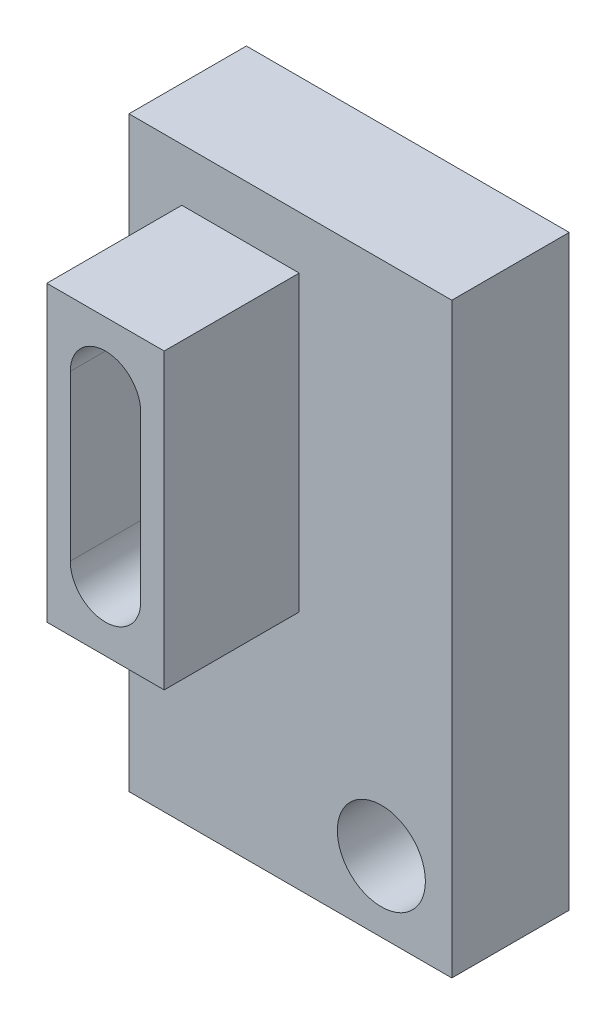
ISO-10303-21;
HEADER;
FILE_DESCRIPTION(('STEP AP214'),'2;1');
FILE_NAME('part.step','',(''),(''),'','','');
FILE_SCHEMA(('AUTOMOTIVE_DESIGN { 1 0 10303 214 1 1 1 1 }'));
ENDSEC;
DATA;
#1=APPLICATION_CONTEXT('core data for automotive mechanical design processes');
#2=APPLICATION_PROTOCOL_DEFINITION('international standard','automotive_design',2000,#1);
#3=PRODUCT_CONTEXT('',#1,'mechanical');
#4=PRODUCT('Part','Part','',(#3));
#5=PRODUCT_RELATED_PRODUCT_CATEGORY('part','',(#4));
#6=PRODUCT_DEFINITION_FORMATION('','',#4);
#7=PRODUCT_DEFINITION_CONTEXT('part definition',#1,'design');
#8=PRODUCT_DEFINITION('design','',#6,#7);
#9=PRODUCT_DEFINITION_SHAPE('','',#8);
#10=(LENGTH_UNIT() NAMED_UNIT(*) SI_UNIT(.MILLI.,.METRE.));
#11=(NAMED_UNIT(*) PLANE_ANGLE_UNIT() SI_UNIT($,.RADIAN.));
#12=(NAMED_UNIT(*) SI_UNIT($,.STERADIAN.) SOLID_ANGLE_UNIT());
#13=UNCERTAINTY_MEASURE_WITH_UNIT(LENGTH_MEASURE(1.E-05),#10,'distance_accuracy_value','');
#14=(GEOMETRIC_REPRESENTATION_CONTEXT(3) GLOBAL_UNCERTAINTY_ASSIGNED_CONTEXT((#13)) GLOBAL_UNIT_ASSIGNED_CONTEXT((#10,
#11,#12)) REPRESENTATION_CONTEXT('',''));
#15=CARTESIAN_POINT('',(0.,0.,0.));
#16=DIRECTION('',(0.,0.,1.));
#17=DIRECTION('',(1.,0.,0.));
#18=AXIS2_PLACEMENT_3D('',#15,#16,#17);
#19=CARTESIAN_POINT('',(0.,0.,20.));
#20=DIRECTION('',(0.,0.,-1.));
#21=DIRECTION('',(-1.,0.,0.));
#22=AXIS2_PLACEMENT_3D('',#19,#20,#21);
#23=PLANE('',#22);
#24=DIRECTION('',(0.,1.,0.));
#25=VECTOR('',#24,1.);
#26=CARTESIAN_POINT('',(27.5,-50.,20.));
#27=LINE('',#26,#25);
#28=CARTESIAN_POINT('',(27.5,-50.,20.));
#29=VERTEX_POINT('',#28);
#30=CARTESIAN_POINT('',(27.5,50.,20.));
#31=VERTEX_POINT('',#30);
#32=EDGE_CURVE('E210',#29,#31,#27,.T.);
#33=ORIENTED_EDGE('',*,*,#32,.T.);
#34=DIRECTION('',(-1.,0.,0.));
#35=VECTOR('',#34,1.);
#36=CARTESIAN_POINT('',(-27.5,50.,20.));
#37=LINE('',#36,#35);
#38=CARTESIAN_POINT('',(-27.5,50.,20.));
#39=VERTEX_POINT('',#38);
#40=EDGE_CURVE('E213',#31,#39,#37,.T.);
#41=ORIENTED_EDGE('',*,*,#40,.T.);
#42=DIRECTION('',(0.,-1.,0.));
#43=VECTOR('',#42,1.);
#44=CARTESIAN_POINT('',(-27.5,-50.,20.));
#45=LINE('',#44,#43);
#46=CARTESIAN_POINT('',(-27.5,-50.,20.));
#47=VERTEX_POINT('',#46);
#48=EDGE_CURVE('E216',#39,#47,#45,.T.);
#49=ORIENTED_EDGE('',*,*,#48,.T.);
#50=DIRECTION('',(1.,0.,0.));
#51=VECTOR('',#50,1.);
#52=CARTESIAN_POINT('',(-27.5,-50.,20.));
#53=LINE('',#52,#51);
#54=EDGE_CURVE('E218',#47,#29,#53,.T.);
#55=ORIENTED_EDGE('',*,*,#54,.T.);
#56=EDGE_LOOP('',(#33,#41,#49,#55));
#57=FACE_BOUND('',#56,.T.);
#58=CARTESIAN_POINT('',(15.5,-38.,20.));
#59=DIRECTION('',(0.,0.,1.));
#60=DIRECTION('',(1.,0.,0.));
#61=AXIS2_PLACEMENT_3D('',#58,#59,#60);
#62=CIRCLE('',#61,7.5);
#63=CARTESIAN_POINT('',(23.,-38.,20.));
#64=VERTEX_POINT('',#63);
#65=EDGE_CURVE('E203',#64,#64,#62,.T.);
#66=ORIENTED_EDGE('',*,*,#65,.F.);
#67=EDGE_LOOP('',(#66));
#68=FACE_BOUND('',#67,.T.);
#69=DIRECTION('',(0.,1.,0.));
#70=VECTOR('',#69,1.);
#71=CARTESIAN_POINT('',(1.5,-9.,20.));
#72=LINE('',#71,#70);
#73=CARTESIAN_POINT('',(1.5,-9.,20.));
#74=VERTEX_POINT('',#73);
#75=CARTESIAN_POINT('',(1.5,41.,20.));
#76=VERTEX_POINT('',#75);
#77=EDGE_CURVE('E167',#74,#76,#72,.T.);
#78=ORIENTED_EDGE('',*,*,#77,.F.);
#79=DIRECTION('',(1.,0.,0.));
#80=VECTOR('',#79,1.);
#81=CARTESIAN_POINT('',(-18.5,-9.,20.));
#82=LINE('',#81,#80);
#83=CARTESIAN_POINT('',(-18.5,-9.,20.));
#84=VERTEX_POINT('',#83);
#85=EDGE_CURVE('E175',#84,#74,#82,.T.);
#86=ORIENTED_EDGE('',*,*,#85,.F.);
#87=DIRECTION('',(0.,-1.,0.));
#88=VECTOR('',#87,1.);
#89=CARTESIAN_POINT('',(-18.5,-9.,20.));
#90=LINE('',#89,#88);
#91=CARTESIAN_POINT('',(-18.5,41.,20.));
#92=VERTEX_POINT('',#91);
#93=EDGE_CURVE('E187',#92,#84,#90,.T.);
#94=ORIENTED_EDGE('',*,*,#93,.F.);
#95=DIRECTION('',(-1.,0.,0.));
#96=VECTOR('',#95,1.);
#97=CARTESIAN_POINT('',(-18.5,41.,20.));
#98=LINE('',#97,#96);
#99=EDGE_CURVE('E184',#76,#92,#98,.T.);
#100=ORIENTED_EDGE('',*,*,#99,.F.);
#101=EDGE_LOOP('',(#78,#86,#94,#100));
#102=FACE_BOUND('',#101,.T.);
#103=ADVANCED_FACE('F45',(#57,#68,#102),#23,.F.);
#104=CARTESIAN_POINT('',(27.5,-50.,20.));
#105=DIRECTION('',(-1.,0.,0.));
#106=DIRECTION('',(0.,0.,1.));
#107=AXIS2_PLACEMENT_3D('',#104,#105,#106);
#108=PLANE('',#107);
#109=DIRECTION('',(0.,1.,0.));
#110=VECTOR('',#109,1.);
#111=CARTESIAN_POINT('',(27.5,-50.,0.));
#112=LINE('',#111,#110);
#113=CARTESIAN_POINT('',(27.5,-50.,0.));
#114=VERTEX_POINT('',#113);
#115=CARTESIAN_POINT('',(27.5,50.,0.));
#116=VERTEX_POINT('',#115);
#117=EDGE_CURVE('E207',#114,#116,#112,.T.);
#118=ORIENTED_EDGE('',*,*,#117,.T.);
#119=DIRECTION('',(0.,0.,-1.));
#120=VECTOR('',#119,1.);
#121=CARTESIAN_POINT('',(27.5,50.,20.));
#122=LINE('',#121,#120);
#123=EDGE_CURVE('E13',#31,#116,#122,.T.);
#124=ORIENTED_EDGE('',*,*,#123,.F.);
#125=ORIENTED_EDGE('',*,*,#32,.F.);
#126=DIRECTION('',(0.,0.,-1.));
#127=VECTOR('',#126,1.);
#128=CARTESIAN_POINT('',(27.5,-50.,20.));
#129=LINE('',#128,#127);
#130=EDGE_CURVE('E220',#29,#114,#129,.T.);
#131=ORIENTED_EDGE('',*,*,#130,.T.);
#132=EDGE_LOOP('',(#118,#124,#125,#131));
#133=FACE_BOUND('',#132,.T.);
#134=ADVANCED_FACE('F47',(#133),#108,.F.);
#135=CARTESIAN_POINT('',(-27.5,50.,20.));
#136=DIRECTION('',(0.,-1.,0.));
#137=DIRECTION('',(0.,0.,-1.));
#138=AXIS2_PLACEMENT_3D('',#135,#136,#137);
#139=PLANE('',#138);
#140=DIRECTION('',(-1.,0.,0.));
#141=VECTOR('',#140,1.);
#142=CARTESIAN_POINT('',(-27.5,50.,0.));
#143=LINE('',#142,#141);
#144=CARTESIAN_POINT('',(-27.5,50.,0.));
#145=VERTEX_POINT('',#144);
#146=EDGE_CURVE('E223',#116,#145,#143,.T.);
#147=ORIENTED_EDGE('',*,*,#146,.T.);
#148=DIRECTION('',(0.,0.,-1.));
#149=VECTOR('',#148,1.);
#150=CARTESIAN_POINT('',(-27.5,50.,20.));
#151=LINE('',#150,#149);
#152=EDGE_CURVE('E53',#39,#145,#151,.T.);
#153=ORIENTED_EDGE('',*,*,#152,.F.);
#154=ORIENTED_EDGE('',*,*,#40,.F.);
#155=ORIENTED_EDGE('',*,*,#123,.T.);
#156=EDGE_LOOP('',(#147,#153,#154,#155));
#157=FACE_BOUND('',#156,.T.);
#158=ADVANCED_FACE('F252',(#157),#139,.F.);
#159=CARTESIAN_POINT('',(-27.5,-50.,20.));
#160=DIRECTION('',(1.,0.,0.));
#161=DIRECTION('',(0.,0.,-1.));
#162=AXIS2_PLACEMENT_3D('',#159,#160,#161);
#163=PLANE('',#162);
#164=DIRECTION('',(0.,-1.,0.));
#165=VECTOR('',#164,1.);
#166=CARTESIAN_POINT('',(-27.5,-50.,0.));
#167=LINE('',#166,#165);
#168=CARTESIAN_POINT('',(-27.5,-50.,0.));
#169=VERTEX_POINT('',#168);
#170=EDGE_CURVE('E225',#145,#169,#167,.T.);
#171=ORIENTED_EDGE('',*,*,#170,.T.);
#172=DIRECTION('',(0.,0.,-1.));
#173=VECTOR('',#172,1.);
#174=CARTESIAN_POINT('',(-27.5,-50.,20.));
#175=LINE('',#174,#173);
#176=EDGE_CURVE('E230',#47,#169,#175,.T.);
#177=ORIENTED_EDGE('',*,*,#176,.F.);
#178=ORIENTED_EDGE('',*,*,#48,.F.);
#179=ORIENTED_EDGE('',*,*,#152,.T.);
#180=EDGE_LOOP('',(#171,#177,#178,#179));
#181=FACE_BOUND('',#180,.T.);
#182=ADVANCED_FACE('F237',(#181),#163,.F.);
#183=CARTESIAN_POINT('',(-27.5,-50.,20.));
#184=DIRECTION('',(0.,1.,0.));
#185=DIRECTION('',(0.,0.,1.));
#186=AXIS2_PLACEMENT_3D('',#183,#184,#185);
#187=PLANE('',#186);
#188=DIRECTION('',(1.,0.,0.));
#189=VECTOR('',#188,1.);
#190=CARTESIAN_POINT('',(-27.5,-50.,0.));
#191=LINE('',#190,#189);
#192=EDGE_CURVE('E214',#169,#114,#191,.T.);
#193=ORIENTED_EDGE('',*,*,#192,.T.);
#194=ORIENTED_EDGE('',*,*,#130,.F.);
#195=ORIENTED_EDGE('',*,*,#54,.F.);
#196=ORIENTED_EDGE('',*,*,#176,.T.);
#197=EDGE_LOOP('',(#193,#194,#195,#196));
#198=FACE_BOUND('',#197,.T.);
#199=ADVANCED_FACE('F245',(#198),#187,.F.);
#200=CARTESIAN_POINT('',(0.,0.,0.));
#201=DIRECTION('',(0.,0.,-1.));
#202=DIRECTION('',(-1.,0.,0.));
#203=AXIS2_PLACEMENT_3D('',#200,#201,#202);
#204=PLANE('',#203);
#205=CARTESIAN_POINT('',(-8.49999999999997,2.,0.));
#206=DIRECTION('',(0.,0.,1.));
#207=DIRECTION('',(1.,0.,0.));
#208=AXIS2_PLACEMENT_3D('',#205,#206,#207);
#209=CIRCLE('',#208,5.99999999999997);
#210=CARTESIAN_POINT('',(-14.5,2.,0.));
#211=VERTEX_POINT('',#210);
#212=CARTESIAN_POINT('',(-2.50000000000002,2.,0.));
#213=VERTEX_POINT('',#212);
#214=EDGE_CURVE('E136',#211,#213,#209,.T.);
#215=ORIENTED_EDGE('',*,*,#214,.T.);
#216=DIRECTION('',(0.,1.,0.));
#217=VECTOR('',#216,1.);
#218=CARTESIAN_POINT('',(-2.50000000000002,2.,0.));
#219=LINE('',#218,#217);
#220=CARTESIAN_POINT('',(-2.50000000000003,30.,0.));
#221=VERTEX_POINT('',#220);
#222=EDGE_CURVE('E145',#213,#221,#219,.T.);
#223=ORIENTED_EDGE('',*,*,#222,.T.);
#224=CARTESIAN_POINT('',(-8.49999999999998,30.,0.));
#225=DIRECTION('',(0.,0.,1.));
#226=DIRECTION('',(1.,0.,0.));
#227=AXIS2_PLACEMENT_3D('',#224,#225,#226);
#228=CIRCLE('',#227,5.99999999999997);
#229=CARTESIAN_POINT('',(-14.5,30.,0.));
#230=VERTEX_POINT('',#229);
#231=EDGE_CURVE('E60',#221,#230,#228,.T.);
#232=ORIENTED_EDGE('',*,*,#231,.T.);
#233=DIRECTION('',(0.,-1.,0.));
#234=VECTOR('',#233,1.);
#235=CARTESIAN_POINT('',(-14.5,2.,0.));
#236=LINE('',#235,#234);
#237=EDGE_CURVE('E142',#230,#211,#236,.T.);
#238=ORIENTED_EDGE('',*,*,#237,.T.);
#239=EDGE_LOOP('',(#215,#223,#232,#238));
#240=FACE_BOUND('',#239,.T.);
#241=CARTESIAN_POINT('',(15.5,-38.,0.));
#242=DIRECTION('',(0.,0.,1.));
#243=DIRECTION('',(1.,0.,0.));
#244=AXIS2_PLACEMENT_3D('',#241,#242,#243);
#245=CIRCLE('',#244,7.5);
#246=CARTESIAN_POINT('',(23.,-38.,0.));
#247=VERTEX_POINT('',#246);
#248=EDGE_CURVE('E204',#247,#247,#245,.T.);
#249=ORIENTED_EDGE('',*,*,#248,.T.);
#250=EDGE_LOOP('',(#249));
#251=FACE_BOUND('',#250,.T.);
#252=ORIENTED_EDGE('',*,*,#117,.F.);
#253=ORIENTED_EDGE('',*,*,#192,.F.);
#254=ORIENTED_EDGE('',*,*,#170,.F.);
#255=ORIENTED_EDGE('',*,*,#146,.F.);
#256=EDGE_LOOP('',(#252,#253,#254,#255));
#257=FACE_BOUND('',#256,.T.);
#258=ADVANCED_FACE('F149',(#240,#251,#257),#204,.T.);
#259=CARTESIAN_POINT('',(15.5,-38.,0.));
#260=DIRECTION('',(0.,0.,1.));
#261=DIRECTION('',(1.,0.,0.));
#262=AXIS2_PLACEMENT_3D('',#259,#260,#261);
#263=CYLINDRICAL_SURFACE('',#262,7.5);
#264=ORIENTED_EDGE('',*,*,#248,.F.);
#265=EDGE_LOOP('',(#264));
#266=FACE_BOUND('',#265,.T.);
#267=ORIENTED_EDGE('',*,*,#65,.T.);
#268=EDGE_LOOP('',(#267));
#269=FACE_BOUND('',#268,.T.);
#270=ADVANCED_FACE('F265',(#266,#269),#263,.F.);
#271=CARTESIAN_POINT('',(1.5,-9.,43.));
#272=DIRECTION('',(-1.,0.,0.));
#273=DIRECTION('',(0.,0.,1.));
#274=AXIS2_PLACEMENT_3D('',#271,#272,#273);
#275=PLANE('',#274);
#276=ORIENTED_EDGE('',*,*,#77,.T.);
#277=DIRECTION('',(0.,0.,-1.));
#278=VECTOR('',#277,1.);
#279=CARTESIAN_POINT('',(1.5,41.,43.));
#280=LINE('',#279,#278);
#281=CARTESIAN_POINT('',(1.5,41.,43.));
#282=VERTEX_POINT('',#281);
#283=EDGE_CURVE('E200',#282,#76,#280,.T.);
#284=ORIENTED_EDGE('',*,*,#283,.F.);
#285=DIRECTION('',(0.,1.,0.));
#286=VECTOR('',#285,1.);
#287=CARTESIAN_POINT('',(1.5,-9.,43.));
#288=LINE('',#287,#286);
#289=CARTESIAN_POINT('',(1.5,-9.,43.));
#290=VERTEX_POINT('',#289);
#291=EDGE_CURVE('E171',#290,#282,#288,.T.);
#292=ORIENTED_EDGE('',*,*,#291,.F.);
#293=DIRECTION('',(0.,0.,-1.));
#294=VECTOR('',#293,1.);
#295=CARTESIAN_POINT('',(1.5,-9.,43.));
#296=LINE('',#295,#294);
#297=EDGE_CURVE('E181',#290,#74,#296,.T.);
#298=ORIENTED_EDGE('',*,*,#297,.T.);
#299=EDGE_LOOP('',(#276,#284,#292,#298));
#300=FACE_BOUND('',#299,.T.);
#301=ADVANCED_FACE('F286',(#300),#275,.F.);
#302=CARTESIAN_POINT('',(-18.5,41.,43.));
#303=DIRECTION('',(0.,-1.,0.));
#304=DIRECTION('',(0.,0.,-1.));
#305=AXIS2_PLACEMENT_3D('',#302,#303,#304);
#306=PLANE('',#305);
#307=ORIENTED_EDGE('',*,*,#99,.T.);
#308=DIRECTION('',(0.,0.,-1.));
#309=VECTOR('',#308,1.);
#310=CARTESIAN_POINT('',(-18.5,41.,43.));
#311=LINE('',#310,#309);
#312=CARTESIAN_POINT('',(-18.5,41.,43.));
#313=VERTEX_POINT('',#312);
#314=EDGE_CURVE('E197',#313,#92,#311,.T.);
#315=ORIENTED_EDGE('',*,*,#314,.F.);
#316=DIRECTION('',(-1.,0.,0.));
#317=VECTOR('',#316,1.);
#318=CARTESIAN_POINT('',(-18.5,41.,43.));
#319=LINE('',#318,#317);
#320=EDGE_CURVE('E174',#282,#313,#319,.T.);
#321=ORIENTED_EDGE('',*,*,#320,.F.);
#322=ORIENTED_EDGE('',*,*,#283,.T.);
#323=EDGE_LOOP('',(#307,#315,#321,#322));
#324=FACE_BOUND('',#323,.T.);
#325=ADVANCED_FACE('F293',(#324),#306,.F.);
#326=CARTESIAN_POINT('',(-18.5,-9.,43.));
#327=DIRECTION('',(1.,0.,0.));
#328=DIRECTION('',(0.,0.,-1.));
#329=AXIS2_PLACEMENT_3D('',#326,#327,#328);
#330=PLANE('',#329);
#331=ORIENTED_EDGE('',*,*,#93,.T.);
#332=DIRECTION('',(0.,0.,-1.));
#333=VECTOR('',#332,1.);
#334=CARTESIAN_POINT('',(-18.5,-9.,43.));
#335=LINE('',#334,#333);
#336=CARTESIAN_POINT('',(-18.5,-9.,43.));
#337=VERTEX_POINT('',#336);
#338=EDGE_CURVE('E194',#337,#84,#335,.T.);
#339=ORIENTED_EDGE('',*,*,#338,.F.);
#340=DIRECTION('',(0.,-1.,0.));
#341=VECTOR('',#340,1.);
#342=CARTESIAN_POINT('',(-18.5,-9.,43.));
#343=LINE('',#342,#341);
#344=EDGE_CURVE('E177',#313,#337,#343,.T.);
#345=ORIENTED_EDGE('',*,*,#344,.F.);
#346=ORIENTED_EDGE('',*,*,#314,.T.);
#347=EDGE_LOOP('',(#331,#339,#345,#346));
#348=FACE_BOUND('',#347,.T.);
#349=ADVANCED_FACE('F300',(#348),#330,.F.);
#350=CARTESIAN_POINT('',(-18.5,-9.,43.));
#351=DIRECTION('',(0.,1.,0.));
#352=DIRECTION('',(0.,0.,1.));
#353=AXIS2_PLACEMENT_3D('',#350,#351,#352);
#354=PLANE('',#353);
#355=ORIENTED_EDGE('',*,*,#85,.T.);
#356=ORIENTED_EDGE('',*,*,#297,.F.);
#357=DIRECTION('',(1.,0.,0.));
#358=VECTOR('',#357,1.);
#359=CARTESIAN_POINT('',(-18.5,-9.,43.));
#360=LINE('',#359,#358);
#361=EDGE_CURVE('E179',#337,#290,#360,.T.);
#362=ORIENTED_EDGE('',*,*,#361,.F.);
#363=ORIENTED_EDGE('',*,*,#338,.T.);
#364=EDGE_LOOP('',(#355,#356,#362,#363));
#365=FACE_BOUND('',#364,.T.);
#366=ADVANCED_FACE('F308',(#365),#354,.F.);
#367=CARTESIAN_POINT('',(0.,0.,43.));
#368=DIRECTION('',(0.,0.,-1.));
#369=DIRECTION('',(-1.,0.,0.));
#370=AXIS2_PLACEMENT_3D('',#367,#368,#369);
#371=PLANE('',#370);
#372=DIRECTION('',(0.,1.,0.));
#373=VECTOR('',#372,1.);
#374=CARTESIAN_POINT('',(-2.50000000000002,2.,43.));
#375=LINE('',#374,#373);
#376=CARTESIAN_POINT('',(-2.50000000000002,2.,43.));
#377=VERTEX_POINT('',#376);
#378=CARTESIAN_POINT('',(-2.50000000000001,30.,43.));
#379=VERTEX_POINT('',#378);
#380=EDGE_CURVE('E161',#377,#379,#375,.T.);
#381=ORIENTED_EDGE('',*,*,#380,.F.);
#382=CARTESIAN_POINT('',(-8.49999999999997,2.,43.));
#383=DIRECTION('',(0.,0.,1.));
#384=DIRECTION('',(1.,0.,0.));
#385=AXIS2_PLACEMENT_3D('',#382,#383,#384);
#386=CIRCLE('',#385,5.99999999999997);
#387=CARTESIAN_POINT('',(-14.5,2.,43.));
#388=VERTEX_POINT('',#387);
#389=EDGE_CURVE('E68',#388,#377,#386,.T.);
#390=ORIENTED_EDGE('',*,*,#389,.F.);
#391=DIRECTION('',(0.,-1.,0.));
#392=VECTOR('',#391,1.);
#393=CARTESIAN_POINT('',(-14.5,2.,43.));
#394=LINE('',#393,#392);
#395=CARTESIAN_POINT('',(-14.5,30.,43.));
#396=VERTEX_POINT('',#395);
#397=EDGE_CURVE('E152',#396,#388,#394,.T.);
#398=ORIENTED_EDGE('',*,*,#397,.F.);
#399=CARTESIAN_POINT('',(-8.49999999999998,30.,43.));
#400=DIRECTION('',(0.,0.,1.));
#401=DIRECTION('',(1.,0.,0.));
#402=AXIS2_PLACEMENT_3D('',#399,#400,#401);
#403=CIRCLE('',#402,5.99999999999997);
#404=EDGE_CURVE('E155',#379,#396,#403,.T.);
#405=ORIENTED_EDGE('',*,*,#404,.F.);
#406=EDGE_LOOP('',(#381,#390,#398,#405));
#407=FACE_BOUND('',#406,.T.);
#408=ORIENTED_EDGE('',*,*,#291,.T.);
#409=ORIENTED_EDGE('',*,*,#320,.T.);
#410=ORIENTED_EDGE('',*,*,#344,.T.);
#411=ORIENTED_EDGE('',*,*,#361,.T.);
#412=EDGE_LOOP('',(#408,#409,#410,#411));
#413=FACE_BOUND('',#412,.T.);
#414=ADVANCED_FACE('F315',(#407,#413),#371,.F.);
#415=CARTESIAN_POINT('',(-8.49999999999997,2.,0.));
#416=DIRECTION('',(0.,0.,1.));
#417=DIRECTION('',(1.,0.,0.));
#418=AXIS2_PLACEMENT_3D('',#415,#416,#417);
#419=CYLINDRICAL_SURFACE('',#418,5.99999999999997);
#420=ORIENTED_EDGE('',*,*,#389,.T.);
#421=DIRECTION('',(0.,0.,1.));
#422=VECTOR('',#421,1.);
#423=CARTESIAN_POINT('',(-2.50000000000002,2.,0.));
#424=LINE('',#423,#422);
#425=EDGE_CURVE('E132',#213,#377,#424,.T.);
#426=ORIENTED_EDGE('',*,*,#425,.F.);
#427=ORIENTED_EDGE('',*,*,#214,.F.);
#428=DIRECTION('',(0.,0.,1.));
#429=VECTOR('',#428,1.);
#430=CARTESIAN_POINT('',(-14.5,2.,0.));
#431=LINE('',#430,#429);
#432=EDGE_CURVE('E165',#211,#388,#431,.T.);
#433=ORIENTED_EDGE('',*,*,#432,.T.);
#434=EDGE_LOOP('',(#420,#426,#427,#433));
#435=FACE_BOUND('',#434,.T.);
#436=ADVANCED_FACE('F134',(#435),#419,.F.);
#437=CARTESIAN_POINT('',(-14.5,2.,0.));
#438=DIRECTION('',(-1.,0.,0.));
#439=DIRECTION('',(0.,-1.,0.));
#440=AXIS2_PLACEMENT_3D('',#437,#438,#439);
#441=PLANE('',#440);
#442=ORIENTED_EDGE('',*,*,#397,.T.);
#443=ORIENTED_EDGE('',*,*,#432,.F.);
#444=ORIENTED_EDGE('',*,*,#237,.F.);
#445=DIRECTION('',(0.,0.,1.));
#446=VECTOR('',#445,1.);
#447=CARTESIAN_POINT('',(-14.5,30.,0.));
#448=LINE('',#447,#446);
#449=EDGE_CURVE('E168',#230,#396,#448,.T.);
#450=ORIENTED_EDGE('',*,*,#449,.T.);
#451=EDGE_LOOP('',(#442,#443,#444,#450));
#452=FACE_BOUND('',#451,.T.);
#453=ADVANCED_FACE('F329',(#452),#441,.F.);
#454=CARTESIAN_POINT('',(-8.49999999999998,30.,0.));
#455=DIRECTION('',(0.,0.,1.));
#456=DIRECTION('',(1.,0.,0.));
#457=AXIS2_PLACEMENT_3D('',#454,#455,#456);
#458=CYLINDRICAL_SURFACE('',#457,5.99999999999997);
#459=ORIENTED_EDGE('',*,*,#404,.T.);
#460=ORIENTED_EDGE('',*,*,#449,.F.);
#461=ORIENTED_EDGE('',*,*,#231,.F.);
#462=DIRECTION('',(0.,0.,1.));
#463=VECTOR('',#462,1.);
#464=CARTESIAN_POINT('',(-2.50000000000001,30.,0.));
#465=LINE('',#464,#463);
#466=EDGE_CURVE('E141',#221,#379,#465,.T.);
#467=ORIENTED_EDGE('',*,*,#466,.T.);
#468=EDGE_LOOP('',(#459,#460,#461,#467));
#469=FACE_BOUND('',#468,.T.);
#470=ADVANCED_FACE('F336',(#469),#458,.F.);
#471=CARTESIAN_POINT('',(-2.50000000000002,2.,0.));
#472=DIRECTION('',(1.,0.,0.));
#473=DIRECTION('',(0.,1.,0.));
#474=AXIS2_PLACEMENT_3D('',#471,#472,#473);
#475=PLANE('',#474);
#476=ORIENTED_EDGE('',*,*,#380,.T.);
#477=ORIENTED_EDGE('',*,*,#466,.F.);
#478=ORIENTED_EDGE('',*,*,#222,.F.);
#479=ORIENTED_EDGE('',*,*,#425,.T.);
#480=EDGE_LOOP('',(#476,#477,#478,#479));
#481=FACE_BOUND('',#480,.T.);
#482=ADVANCED_FACE('F146',(#481),#475,.F.);
#483=CLOSED_SHELL('',(#103,#134,#158,#182,#199,#258,#270,#301,#325,#349,#366,#414,#436,#453,
#470,#482));
#484=MANIFOLD_SOLID_BREP('B2',#483);
#485=ADVANCED_BREP_SHAPE_REPRESENTATION('',(#18,#484),#14);
#486=SHAPE_DEFINITION_REPRESENTATION(#9,#485);
ENDSEC;
END-ISO-10303-21;
